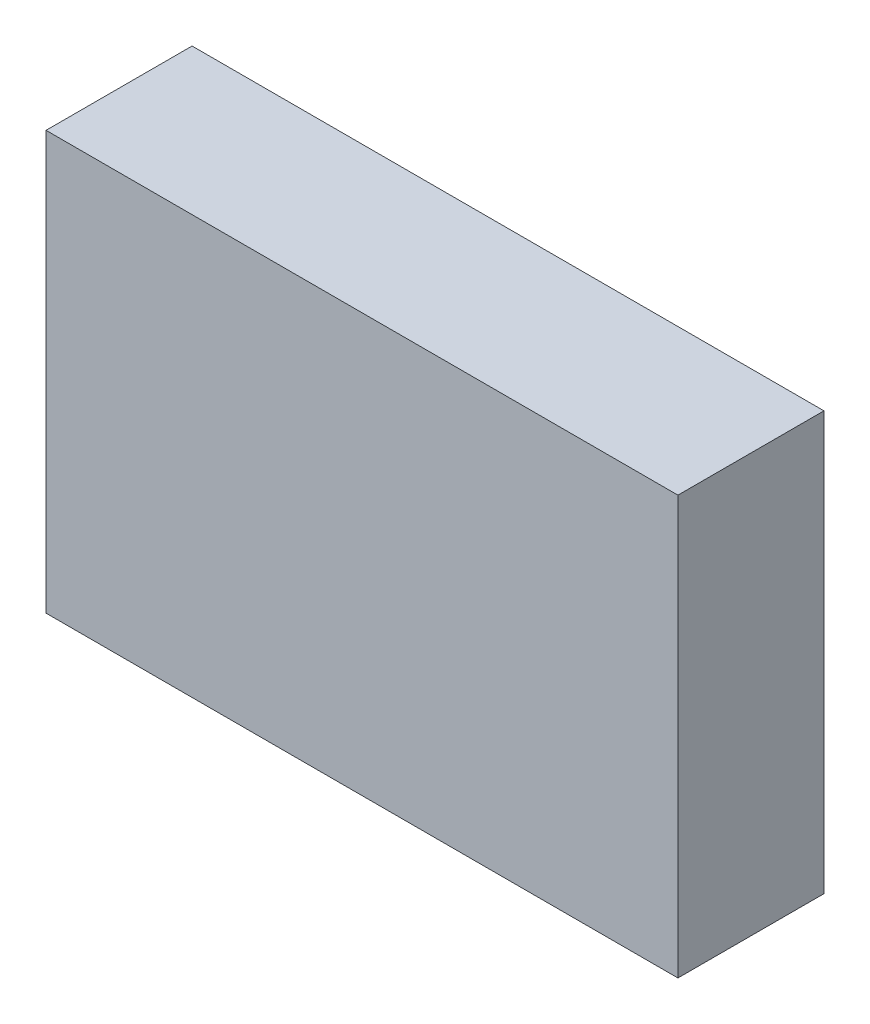
ISO-10303-21;
HEADER;
FILE_DESCRIPTION(('STEP AP214'),'2;1');
FILE_NAME('part.step','',(''),(''),'','','');
FILE_SCHEMA(('AUTOMOTIVE_DESIGN { 1 0 10303 214 1 1 1 1 }'));
ENDSEC;
DATA;
#1=APPLICATION_CONTEXT('core data for automotive mechanical design processes');
#2=APPLICATION_PROTOCOL_DEFINITION('international standard','automotive_design',2000,#1);
#3=PRODUCT_CONTEXT('',#1,'mechanical');
#4=PRODUCT('Part','Part','',(#3));
#5=PRODUCT_RELATED_PRODUCT_CATEGORY('part','',(#4));
#6=PRODUCT_DEFINITION_FORMATION('','',#4);
#7=PRODUCT_DEFINITION_CONTEXT('part definition',#1,'design');
#8=PRODUCT_DEFINITION('design','',#6,#7);
#9=PRODUCT_DEFINITION_SHAPE('','',#8);
#10=(LENGTH_UNIT() NAMED_UNIT(*) SI_UNIT(.MILLI.,.METRE.));
#11=(NAMED_UNIT(*) PLANE_ANGLE_UNIT() SI_UNIT($,.RADIAN.));
#12=(NAMED_UNIT(*) SI_UNIT($,.STERADIAN.) SOLID_ANGLE_UNIT());
#13=UNCERTAINTY_MEASURE_WITH_UNIT(LENGTH_MEASURE(1.E-05),#10,'distance_accuracy_value','');
#14=(GEOMETRIC_REPRESENTATION_CONTEXT(3) GLOBAL_UNCERTAINTY_ASSIGNED_CONTEXT((#13)) GLOBAL_UNIT_ASSIGNED_CONTEXT((#10,
#11,#12)) REPRESENTATION_CONTEXT('',''));
#15=CARTESIAN_POINT('',(0.,0.,0.));
#16=DIRECTION('',(0.,0.,1.));
#17=DIRECTION('',(1.,0.,0.));
#18=AXIS2_PLACEMENT_3D('',#15,#16,#17);
#19=CARTESIAN_POINT('',(0.,0.,1.));
#20=DIRECTION('',(0.,0.,1.));
#21=DIRECTION('',(1.,0.,0.));
#22=AXIS2_PLACEMENT_3D('',#19,#20,#21);
#23=PLANE('',#22);
#24=DIRECTION('',(1.,0.,0.));
#25=VECTOR('',#24,1.);
#26=CARTESIAN_POINT('',(2.1635,1.4635,1.));
#27=LINE('',#26,#25);
#28=CARTESIAN_POINT('',(-2.1635,1.4635,1.));
#29=VERTEX_POINT('',#28);
#30=CARTESIAN_POINT('',(2.1635,1.4635,1.));
#31=VERTEX_POINT('',#30);
#32=EDGE_CURVE('E68',#29,#31,#27,.T.);
#33=ORIENTED_EDGE('',*,*,#32,.F.);
#34=DIRECTION('',(0.,1.,0.));
#35=VECTOR('',#34,1.);
#36=CARTESIAN_POINT('',(-2.1635,1.4635,1.));
#37=LINE('',#36,#35);
#38=CARTESIAN_POINT('',(-2.1635,-1.4,1.));
#39=VERTEX_POINT('',#38);
#40=EDGE_CURVE('E20',#39,#29,#37,.T.);
#41=ORIENTED_EDGE('',*,*,#40,.F.);
#42=DIRECTION('',(1.,0.,0.));
#43=VECTOR('',#42,1.);
#44=CARTESIAN_POINT('',(-2.1635,-1.4,1.));
#45=LINE('',#44,#43);
#46=CARTESIAN_POINT('',(2.1635,-1.4,1.));
#47=VERTEX_POINT('',#46);
#48=EDGE_CURVE('E58',#47,#39,#45,.F.);
#49=ORIENTED_EDGE('',*,*,#48,.F.);
#50=DIRECTION('',(0.,1.,0.));
#51=VECTOR('',#50,1.);
#52=CARTESIAN_POINT('',(2.1635,-1.4,1.));
#53=LINE('',#52,#51);
#54=EDGE_CURVE('E53',#31,#47,#53,.F.);
#55=ORIENTED_EDGE('',*,*,#54,.F.);
#56=EDGE_LOOP('',(#33,#41,#49,#55));
#57=FACE_BOUND('',#56,.T.);
#58=ADVANCED_FACE('F17',(#57),#23,.T.);
#59=CARTESIAN_POINT('',(-2.1635,1.4635,0.));
#60=DIRECTION('',(-1.,0.,0.));
#61=DIRECTION('',(0.,0.,1.));
#62=AXIS2_PLACEMENT_3D('',#59,#60,#61);
#63=PLANE('',#62);
#64=DIRECTION('',(0.,0.,1.));
#65=VECTOR('',#64,1.);
#66=CARTESIAN_POINT('',(-2.1635,1.4635,0.));
#67=LINE('',#66,#65);
#68=CARTESIAN_POINT('',(-2.1635,1.4635,0.));
#69=VERTEX_POINT('',#68);
#70=EDGE_CURVE('E79',#69,#29,#67,.T.);
#71=ORIENTED_EDGE('',*,*,#70,.F.);
#72=DIRECTION('',(0.,1.,0.));
#73=VECTOR('',#72,1.);
#74=CARTESIAN_POINT('',(-2.1635,0.,0.));
#75=LINE('',#74,#73);
#76=CARTESIAN_POINT('',(-2.1635,-1.4,0.));
#77=VERTEX_POINT('',#76);
#78=EDGE_CURVE('E74',#69,#77,#75,.F.);
#79=ORIENTED_EDGE('',*,*,#78,.T.);
#80=DIRECTION('',(0.,0.,-1.));
#81=VECTOR('',#80,1.);
#82=CARTESIAN_POINT('',(-2.1635,-1.4,0.));
#83=LINE('',#82,#81);
#84=EDGE_CURVE('E63',#39,#77,#83,.T.);
#85=ORIENTED_EDGE('',*,*,#84,.F.);
#86=ORIENTED_EDGE('',*,*,#40,.T.);
#87=EDGE_LOOP('',(#71,#79,#85,#86));
#88=FACE_BOUND('',#87,.T.);
#89=ADVANCED_FACE('F73',(#88),#63,.T.);
#90=CARTESIAN_POINT('',(-2.1635,-1.4,0.));
#91=DIRECTION('',(0.,-1.,0.));
#92=DIRECTION('',(0.,0.,-1.));
#93=AXIS2_PLACEMENT_3D('',#90,#91,#92);
#94=PLANE('',#93);
#95=ORIENTED_EDGE('',*,*,#84,.T.);
#96=DIRECTION('',(1.,0.,0.));
#97=VECTOR('',#96,1.);
#98=CARTESIAN_POINT('',(0.,-1.4,0.));
#99=LINE('',#98,#97);
#100=CARTESIAN_POINT('',(2.1635,-1.4,0.));
#101=VERTEX_POINT('',#100);
#102=EDGE_CURVE('E84',#77,#101,#99,.T.);
#103=ORIENTED_EDGE('',*,*,#102,.T.);
#104=DIRECTION('',(0.,0.,-1.));
#105=VECTOR('',#104,1.);
#106=CARTESIAN_POINT('',(2.1635,-1.4,0.));
#107=LINE('',#106,#105);
#108=EDGE_CURVE('E65',#47,#101,#107,.T.);
#109=ORIENTED_EDGE('',*,*,#108,.F.);
#110=ORIENTED_EDGE('',*,*,#48,.T.);
#111=EDGE_LOOP('',(#95,#103,#109,#110));
#112=FACE_BOUND('',#111,.T.);
#113=ADVANCED_FACE('F60',(#112),#94,.T.);
#114=CARTESIAN_POINT('',(2.1635,-1.4,0.));
#115=DIRECTION('',(1.,0.,0.));
#116=DIRECTION('',(0.,0.,-1.));
#117=AXIS2_PLACEMENT_3D('',#114,#115,#116);
#118=PLANE('',#117);
#119=ORIENTED_EDGE('',*,*,#108,.T.);
#120=DIRECTION('',(0.,1.,0.));
#121=VECTOR('',#120,1.);
#122=CARTESIAN_POINT('',(2.1635,0.,0.));
#123=LINE('',#122,#121);
#124=CARTESIAN_POINT('',(2.1635,1.4635,0.));
#125=VERTEX_POINT('',#124);
#126=EDGE_CURVE('E26',#101,#125,#123,.T.);
#127=ORIENTED_EDGE('',*,*,#126,.T.);
#128=DIRECTION('',(0.,0.,1.));
#129=VECTOR('',#128,1.);
#130=CARTESIAN_POINT('',(2.1635,1.4635,0.));
#131=LINE('',#130,#129);
#132=EDGE_CURVE('E34',#31,#125,#131,.F.);
#133=ORIENTED_EDGE('',*,*,#132,.F.);
#134=ORIENTED_EDGE('',*,*,#54,.T.);
#135=EDGE_LOOP('',(#119,#127,#133,#134));
#136=FACE_BOUND('',#135,.T.);
#137=ADVANCED_FACE('F88',(#136),#118,.T.);
#138=CARTESIAN_POINT('',(2.1635,1.4635,0.));
#139=DIRECTION('',(0.,1.,0.));
#140=DIRECTION('',(0.,0.,1.));
#141=AXIS2_PLACEMENT_3D('',#138,#139,#140);
#142=PLANE('',#141);
#143=ORIENTED_EDGE('',*,*,#132,.T.);
#144=DIRECTION('',(1.,0.,0.));
#145=VECTOR('',#144,1.);
#146=CARTESIAN_POINT('',(0.,1.4635,0.));
#147=LINE('',#146,#145);
#148=EDGE_CURVE('E11',#125,#69,#147,.F.);
#149=ORIENTED_EDGE('',*,*,#148,.T.);
#150=ORIENTED_EDGE('',*,*,#70,.T.);
#151=ORIENTED_EDGE('',*,*,#32,.T.);
#152=EDGE_LOOP('',(#143,#149,#150,#151));
#153=FACE_BOUND('',#152,.T.);
#154=ADVANCED_FACE('F91',(#153),#142,.T.);
#155=CARTESIAN_POINT('',(0.,0.,0.));
#156=DIRECTION('',(0.,0.,1.));
#157=DIRECTION('',(1.,0.,0.));
#158=AXIS2_PLACEMENT_3D('',#155,#156,#157);
#159=PLANE('',#158);
#160=ORIENTED_EDGE('',*,*,#126,.F.);
#161=ORIENTED_EDGE('',*,*,#102,.F.);
#162=ORIENTED_EDGE('',*,*,#78,.F.);
#163=ORIENTED_EDGE('',*,*,#148,.F.);
#164=EDGE_LOOP('',(#160,#161,#162,#163));
#165=FACE_BOUND('',#164,.T.);
#166=ADVANCED_FACE('F90',(#165),#159,.F.);
#167=CLOSED_SHELL('',(#58,#89,#113,#137,#154,#166));
#168=MANIFOLD_SOLID_BREP('B1',#167);
#169=ADVANCED_BREP_SHAPE_REPRESENTATION('',(#18,#168),#14);
#170=SHAPE_DEFINITION_REPRESENTATION(#9,#169);
ENDSEC;
END-ISO-10303-21;
